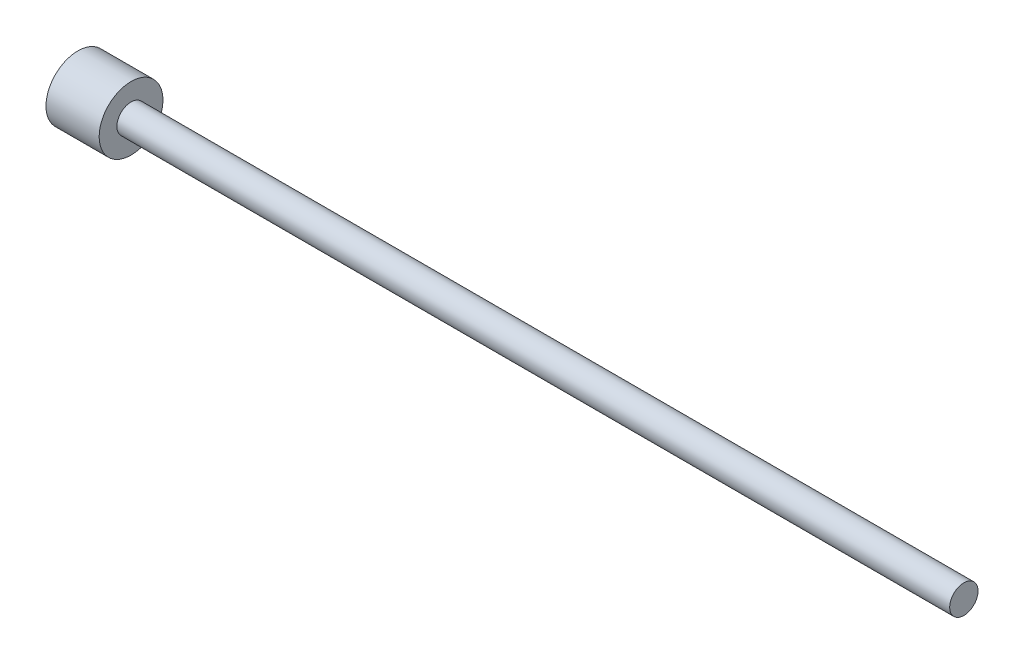
ISO-10303-21;
HEADER;
FILE_DESCRIPTION(('STEP AP214'),'2;1');
FILE_NAME('part.step','',(''),(''),'','','');
FILE_SCHEMA(('AUTOMOTIVE_DESIGN { 1 0 10303 214 1 1 1 1 }'));
ENDSEC;
DATA;
#1=APPLICATION_CONTEXT('core data for automotive mechanical design processes');
#2=APPLICATION_PROTOCOL_DEFINITION('international standard','automotive_design',2000,#1);
#3=PRODUCT_CONTEXT('',#1,'mechanical');
#4=PRODUCT('Part','Part','',(#3));
#5=PRODUCT_RELATED_PRODUCT_CATEGORY('part','',(#4));
#6=PRODUCT_DEFINITION_FORMATION('','',#4);
#7=PRODUCT_DEFINITION_CONTEXT('part definition',#1,'design');
#8=PRODUCT_DEFINITION('design','',#6,#7);
#9=PRODUCT_DEFINITION_SHAPE('','',#8);
#10=(LENGTH_UNIT() NAMED_UNIT(*) SI_UNIT(.MILLI.,.METRE.));
#11=(NAMED_UNIT(*) PLANE_ANGLE_UNIT() SI_UNIT($,.RADIAN.));
#12=(NAMED_UNIT(*) SI_UNIT($,.STERADIAN.) SOLID_ANGLE_UNIT());
#13=UNCERTAINTY_MEASURE_WITH_UNIT(LENGTH_MEASURE(1.E-05),#10,'distance_accuracy_value','');
#14=(GEOMETRIC_REPRESENTATION_CONTEXT(3) GLOBAL_UNCERTAINTY_ASSIGNED_CONTEXT((#13)) GLOBAL_UNIT_ASSIGNED_CONTEXT((#10,
#11,#12)) REPRESENTATION_CONTEXT('',''));
#15=CARTESIAN_POINT('',(0.,0.,0.));
#16=DIRECTION('',(0.,0.,1.));
#17=DIRECTION('',(1.,0.,0.));
#18=AXIS2_PLACEMENT_3D('',#15,#16,#17);
#19=CARTESIAN_POINT('',(0.,0.,0.));
#20=DIRECTION('',(1.,0.,0.));
#21=DIRECTION('',(0.,0.,-1.));
#22=AXIS2_PLACEMENT_3D('',#19,#20,#21);
#23=PLANE('',#22);
#24=CARTESIAN_POINT('',(0.,0.,0.));
#25=DIRECTION('',(-1.,0.,0.));
#26=DIRECTION('',(0.,0.,1.));
#27=AXIS2_PLACEMENT_3D('',#24,#25,#26);
#28=CIRCLE('',#27,9.);
#29=CARTESIAN_POINT('',(0.,0.,9.));
#30=VERTEX_POINT('',#29);
#31=EDGE_CURVE('E10',#30,#30,#28,.T.);
#32=ORIENTED_EDGE('',*,*,#31,.T.);
#33=EDGE_LOOP('',(#32));
#34=FACE_BOUND('',#33,.T.);
#35=ADVANCED_FACE('F30',(#34),#23,.F.);
#36=CARTESIAN_POINT('',(0.,0.,0.));
#37=DIRECTION('',(-1.,0.,0.));
#38=DIRECTION('',(0.,0.,1.));
#39=AXIS2_PLACEMENT_3D('',#36,#37,#38);
#40=CYLINDRICAL_SURFACE('',#39,9.);
#41=ORIENTED_EDGE('',*,*,#31,.F.);
#42=EDGE_LOOP('',(#41));
#43=FACE_BOUND('',#42,.T.);
#44=CARTESIAN_POINT('',(15.,0.,0.));
#45=DIRECTION('',(-1.,0.,0.));
#46=DIRECTION('',(0.,0.,1.));
#47=AXIS2_PLACEMENT_3D('',#44,#45,#46);
#48=CIRCLE('',#47,9.);
#49=CARTESIAN_POINT('',(15.,0.,9.));
#50=VERTEX_POINT('',#49);
#51=EDGE_CURVE('E36',#50,#50,#48,.T.);
#52=ORIENTED_EDGE('',*,*,#51,.T.);
#53=EDGE_LOOP('',(#52));
#54=FACE_BOUND('',#53,.T.);
#55=ADVANCED_FACE('F62',(#43,#54),#40,.T.);
#56=CARTESIAN_POINT('',(15.,9.,0.));
#57=DIRECTION('',(-1.,0.,0.));
#58=DIRECTION('',(0.,0.,1.));
#59=AXIS2_PLACEMENT_3D('',#56,#57,#58);
#60=PLANE('',#59);
#61=ORIENTED_EDGE('',*,*,#51,.F.);
#62=EDGE_LOOP('',(#61));
#63=FACE_BOUND('',#62,.T.);
#64=CARTESIAN_POINT('',(15.,0.,0.));
#65=DIRECTION('',(-1.,0.,0.));
#66=DIRECTION('',(0.,0.,1.));
#67=AXIS2_PLACEMENT_3D('',#64,#65,#66);
#68=CIRCLE('',#67,4.);
#69=CARTESIAN_POINT('',(15.,0.,4.));
#70=VERTEX_POINT('',#69);
#71=EDGE_CURVE('E40',#70,#70,#68,.T.);
#72=ORIENTED_EDGE('',*,*,#71,.T.);
#73=EDGE_LOOP('',(#72));
#74=FACE_BOUND('',#73,.T.);
#75=ADVANCED_FACE('F58',(#63,#74),#60,.F.);
#76=CARTESIAN_POINT('',(0.,0.,0.));
#77=DIRECTION('',(-1.,0.,0.));
#78=DIRECTION('',(0.,0.,1.));
#79=AXIS2_PLACEMENT_3D('',#76,#77,#78);
#80=CYLINDRICAL_SURFACE('',#79,4.);
#81=ORIENTED_EDGE('',*,*,#71,.F.);
#82=EDGE_LOOP('',(#81));
#83=FACE_BOUND('',#82,.T.);
#84=CARTESIAN_POINT('',(250.,0.,0.));
#85=DIRECTION('',(-1.,0.,0.));
#86=DIRECTION('',(0.,0.,1.));
#87=AXIS2_PLACEMENT_3D('',#84,#85,#86);
#88=CIRCLE('',#87,4.);
#89=CARTESIAN_POINT('',(250.,0.,4.));
#90=VERTEX_POINT('',#89);
#91=EDGE_CURVE('E44',#90,#90,#88,.T.);
#92=ORIENTED_EDGE('',*,*,#91,.T.);
#93=EDGE_LOOP('',(#92));
#94=FACE_BOUND('',#93,.T.);
#95=ADVANCED_FACE('F50',(#83,#94),#80,.T.);
#96=CARTESIAN_POINT('',(250.,4.,0.));
#97=DIRECTION('',(-1.,0.,0.));
#98=DIRECTION('',(0.,0.,1.));
#99=AXIS2_PLACEMENT_3D('',#96,#97,#98);
#100=PLANE('',#99);
#101=ORIENTED_EDGE('',*,*,#91,.F.);
#102=EDGE_LOOP('',(#101));
#103=FACE_BOUND('',#102,.T.);
#104=ADVANCED_FACE('F52',(#103),#100,.F.);
#105=CLOSED_SHELL('',(#35,#55,#75,#95,#104));
#106=MANIFOLD_SOLID_BREP('B2',#105);
#107=ADVANCED_BREP_SHAPE_REPRESENTATION('',(#18,#106),#14);
#108=SHAPE_DEFINITION_REPRESENTATION(#9,#107);
ENDSEC;
END-ISO-10303-21;
